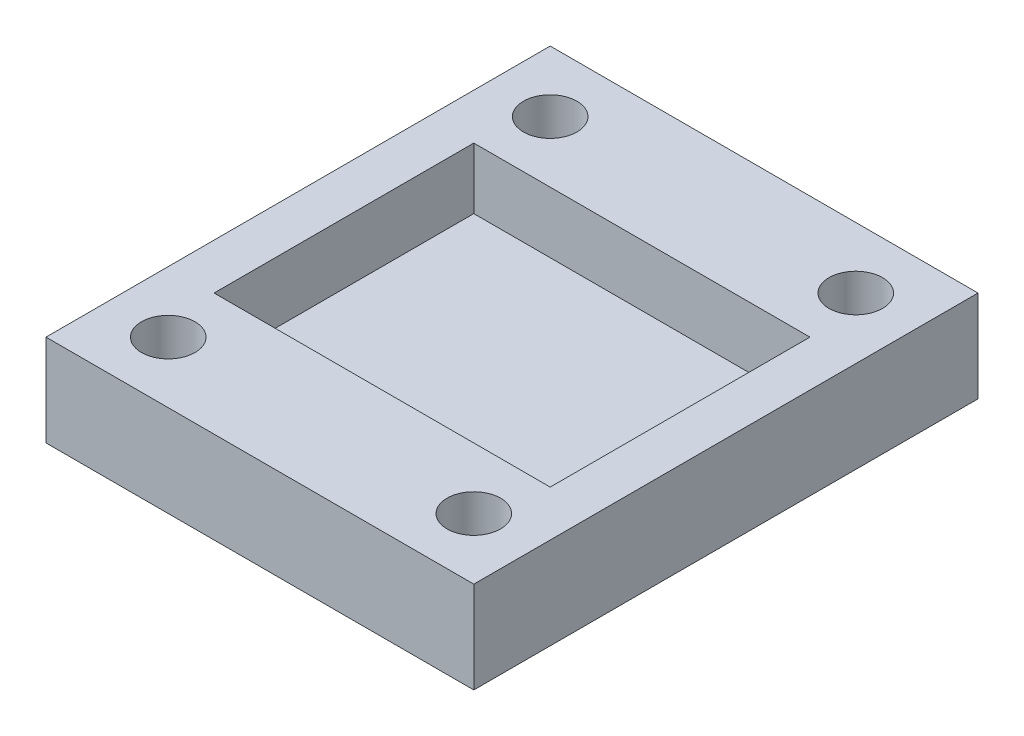
ISO-10303-21;
HEADER;
FILE_DESCRIPTION(('STEP AP214'),'2;1');
FILE_NAME('part.step','',(''),(''),'','','');
FILE_SCHEMA(('AUTOMOTIVE_DESIGN { 1 0 10303 214 1 1 1 1 }'));
ENDSEC;
DATA;
#1=APPLICATION_CONTEXT('core data for automotive mechanical design processes');
#2=APPLICATION_PROTOCOL_DEFINITION('international standard','automotive_design',2000,#1);
#3=PRODUCT_CONTEXT('',#1,'mechanical');
#4=PRODUCT('Part','Part','',(#3));
#5=PRODUCT_RELATED_PRODUCT_CATEGORY('part','',(#4));
#6=PRODUCT_DEFINITION_FORMATION('','',#4);
#7=PRODUCT_DEFINITION_CONTEXT('part definition',#1,'design');
#8=PRODUCT_DEFINITION('design','',#6,#7);
#9=PRODUCT_DEFINITION_SHAPE('','',#8);
#10=(LENGTH_UNIT() NAMED_UNIT(*) SI_UNIT(.MILLI.,.METRE.));
#11=(NAMED_UNIT(*) PLANE_ANGLE_UNIT() SI_UNIT($,.RADIAN.));
#12=(NAMED_UNIT(*) SI_UNIT($,.STERADIAN.) SOLID_ANGLE_UNIT());
#13=UNCERTAINTY_MEASURE_WITH_UNIT(LENGTH_MEASURE(1.E-05),#10,'distance_accuracy_value','');
#14=(GEOMETRIC_REPRESENTATION_CONTEXT(3) GLOBAL_UNCERTAINTY_ASSIGNED_CONTEXT((#13)) GLOBAL_UNIT_ASSIGNED_CONTEXT((#10,
#11,#12)) REPRESENTATION_CONTEXT('',''));
#15=CARTESIAN_POINT('',(0.,0.,0.));
#16=DIRECTION('',(0.,0.,1.));
#17=DIRECTION('',(1.,0.,0.));
#18=AXIS2_PLACEMENT_3D('',#15,#16,#17);
#19=CARTESIAN_POINT('',(0.,2.,0.));
#20=DIRECTION('',(0.,1.,0.));
#21=DIRECTION('',(0.,0.,1.));
#22=AXIS2_PLACEMENT_3D('',#19,#20,#21);
#23=PLANE('',#22);
#24=DIRECTION('',(1.,0.,0.));
#25=VECTOR('',#24,1.);
#26=CARTESIAN_POINT('',(0.,2.,0.));
#27=LINE('',#26,#25);
#28=CARTESIAN_POINT('',(0.,2.,0.));
#29=VERTEX_POINT('',#28);
#30=CARTESIAN_POINT('',(22.,2.,0.));
#31=VERTEX_POINT('',#30);
#32=EDGE_CURVE('E118',#29,#31,#27,.T.);
#33=ORIENTED_EDGE('',*,*,#32,.T.);
#34=DIRECTION('',(0.,0.,-1.));
#35=VECTOR('',#34,1.);
#36=CARTESIAN_POINT('',(22.,2.,0.));
#37=LINE('',#36,#35);
#38=CARTESIAN_POINT('',(22.,2.,-17.));
#39=VERTEX_POINT('',#38);
#40=EDGE_CURVE('E168',#31,#39,#37,.T.);
#41=ORIENTED_EDGE('',*,*,#40,.T.);
#42=DIRECTION('',(1.,0.,0.));
#43=VECTOR('',#42,1.);
#44=CARTESIAN_POINT('',(0.,2.,-17.));
#45=LINE('',#44,#43);
#46=CARTESIAN_POINT('',(0.,2.,-17.));
#47=VERTEX_POINT('',#46);
#48=EDGE_CURVE('E49',#47,#39,#45,.T.);
#49=ORIENTED_EDGE('',*,*,#48,.F.);
#50=DIRECTION('',(0.,0.,-1.));
#51=VECTOR('',#50,1.);
#52=CARTESIAN_POINT('',(0.,2.,0.));
#53=LINE('',#52,#51);
#54=EDGE_CURVE('E11',#29,#47,#53,.T.);
#55=ORIENTED_EDGE('',*,*,#54,.F.);
#56=EDGE_LOOP('',(#33,#41,#49,#55));
#57=FACE_BOUND('',#56,.T.);
#58=ADVANCED_FACE('F41',(#57),#23,.T.);
#59=CARTESIAN_POINT('',(0.,6.,0.));
#60=DIRECTION('',(0.,1.,0.));
#61=DIRECTION('',(0.,0.,1.));
#62=AXIS2_PLACEMENT_3D('',#59,#60,#61);
#63=PLANE('',#62);
#64=CARTESIAN_POINT('',(21.,6.,-21.));
#65=DIRECTION('',(0.,1.,0.));
#66=DIRECTION('',(0.,0.,1.));
#67=AXIS2_PLACEMENT_3D('',#64,#65,#66);
#68=CIRCLE('',#67,1.75);
#69=CARTESIAN_POINT('',(21.,6.,-19.25));
#70=VERTEX_POINT('',#69);
#71=EDGE_CURVE('E236',#70,#70,#68,.T.);
#72=ORIENTED_EDGE('',*,*,#71,.F.);
#73=EDGE_LOOP('',(#72));
#74=FACE_BOUND('',#73,.T.);
#75=CARTESIAN_POINT('',(0.999999999999985,6.,4.));
#76=DIRECTION('',(0.,1.,0.));
#77=DIRECTION('',(0.,0.,1.));
#78=AXIS2_PLACEMENT_3D('',#75,#76,#77);
#79=CIRCLE('',#78,1.75);
#80=CARTESIAN_POINT('',(0.999999999999985,6.,5.75));
#81=VERTEX_POINT('',#80);
#82=EDGE_CURVE('E112',#81,#81,#79,.T.);
#83=ORIENTED_EDGE('',*,*,#82,.F.);
#84=EDGE_LOOP('',(#83));
#85=FACE_BOUND('',#84,.T.);
#86=DIRECTION('',(1.,0.,0.));
#87=VECTOR('',#86,1.);
#88=CARTESIAN_POINT('',(-3.,6.,8.));
#89=LINE('',#88,#87);
#90=CARTESIAN_POINT('',(-3.,6.,8.));
#91=VERTEX_POINT('',#90);
#92=CARTESIAN_POINT('',(25.,6.,8.));
#93=VERTEX_POINT('',#92);
#94=EDGE_CURVE('E138',#91,#93,#89,.T.);
#95=ORIENTED_EDGE('',*,*,#94,.T.);
#96=DIRECTION('',(0.,0.,-1.));
#97=VECTOR('',#96,1.);
#98=CARTESIAN_POINT('',(25.,6.,8.));
#99=LINE('',#98,#97);
#100=CARTESIAN_POINT('',(25.,6.,-25.));
#101=VERTEX_POINT('',#100);
#102=EDGE_CURVE('E141',#93,#101,#99,.T.);
#103=ORIENTED_EDGE('',*,*,#102,.T.);
#104=DIRECTION('',(-1.,0.,0.));
#105=VECTOR('',#104,1.);
#106=CARTESIAN_POINT('',(25.,6.,-25.));
#107=LINE('',#106,#105);
#108=CARTESIAN_POINT('',(-3.,6.,-25.));
#109=VERTEX_POINT('',#108);
#110=EDGE_CURVE('E144',#101,#109,#107,.T.);
#111=ORIENTED_EDGE('',*,*,#110,.T.);
#112=DIRECTION('',(0.,0.,1.));
#113=VECTOR('',#112,1.);
#114=CARTESIAN_POINT('',(-3.,6.,8.));
#115=LINE('',#114,#113);
#116=EDGE_CURVE('E146',#109,#91,#115,.T.);
#117=ORIENTED_EDGE('',*,*,#116,.T.);
#118=EDGE_LOOP('',(#95,#103,#111,#117));
#119=FACE_BOUND('',#118,.T.);
#120=DIRECTION('',(1.,0.,0.));
#121=VECTOR('',#120,1.);
#122=CARTESIAN_POINT('',(0.,6.,0.));
#123=LINE('',#122,#121);
#124=CARTESIAN_POINT('',(0.,6.,0.));
#125=VERTEX_POINT('',#124);
#126=CARTESIAN_POINT('',(22.,6.,0.));
#127=VERTEX_POINT('',#126);
#128=EDGE_CURVE('E111',#125,#127,#123,.T.);
#129=ORIENTED_EDGE('',*,*,#128,.F.);
#130=DIRECTION('',(0.,0.,1.));
#131=VECTOR('',#130,1.);
#132=CARTESIAN_POINT('',(0.,6.,0.));
#133=LINE('',#132,#131);
#134=CARTESIAN_POINT('',(0.,6.,-17.));
#135=VERTEX_POINT('',#134);
#136=EDGE_CURVE('E102',#135,#125,#133,.T.);
#137=ORIENTED_EDGE('',*,*,#136,.F.);
#138=DIRECTION('',(-1.,0.,0.));
#139=VECTOR('',#138,1.);
#140=CARTESIAN_POINT('',(0.,6.,-17.));
#141=LINE('',#140,#139);
#142=CARTESIAN_POINT('',(22.,6.,-17.));
#143=VERTEX_POINT('',#142);
#144=EDGE_CURVE('E128',#143,#135,#141,.T.);
#145=ORIENTED_EDGE('',*,*,#144,.F.);
#146=DIRECTION('',(0.,0.,-1.));
#147=VECTOR('',#146,1.);
#148=CARTESIAN_POINT('',(22.,6.,0.));
#149=LINE('',#148,#147);
#150=EDGE_CURVE('E126',#127,#143,#149,.T.);
#151=ORIENTED_EDGE('',*,*,#150,.F.);
#152=EDGE_LOOP('',(#129,#137,#145,#151));
#153=FACE_BOUND('',#152,.T.);
#154=CARTESIAN_POINT('',(21.,6.,4.));
#155=DIRECTION('',(0.,1.,0.));
#156=DIRECTION('',(0.,0.,-1.));
#157=AXIS2_PLACEMENT_3D('',#154,#155,#156);
#158=CIRCLE('',#157,1.75);
#159=CARTESIAN_POINT('',(21.,6.,2.25));
#160=VERTEX_POINT('',#159);
#161=EDGE_CURVE('E242',#160,#160,#158,.T.);
#162=ORIENTED_EDGE('',*,*,#161,.F.);
#163=EDGE_LOOP('',(#162));
#164=FACE_BOUND('',#163,.T.);
#165=CARTESIAN_POINT('',(0.999999999999985,6.,-21.));
#166=DIRECTION('',(0.,1.,0.));
#167=DIRECTION('',(0.,0.,-1.));
#168=AXIS2_PLACEMENT_3D('',#165,#166,#167);
#169=CIRCLE('',#168,1.75);
#170=CARTESIAN_POINT('',(0.999999999999985,6.,-22.75));
#171=VERTEX_POINT('',#170);
#172=EDGE_CURVE('E227',#171,#171,#169,.T.);
#173=ORIENTED_EDGE('',*,*,#172,.F.);
#174=EDGE_LOOP('',(#173));
#175=FACE_BOUND('',#174,.T.);
#176=ADVANCED_FACE('F123',(#74,#85,#119,#153,#164,#175),#63,.T.);
#177=CARTESIAN_POINT('',(-3.,6.,8.));
#178=DIRECTION('',(0.,0.,-1.));
#179=DIRECTION('',(-1.,0.,0.));
#180=AXIS2_PLACEMENT_3D('',#177,#178,#179);
#181=PLANE('',#180);
#182=DIRECTION('',(1.,0.,0.));
#183=VECTOR('',#182,1.);
#184=CARTESIAN_POINT('',(-3.,0.,8.));
#185=LINE('',#184,#183);
#186=CARTESIAN_POINT('',(-3.,0.,8.));
#187=VERTEX_POINT('',#186);
#188=CARTESIAN_POINT('',(25.,0.,8.));
#189=VERTEX_POINT('',#188);
#190=EDGE_CURVE('E119',#187,#189,#185,.T.);
#191=ORIENTED_EDGE('',*,*,#190,.T.);
#192=DIRECTION('',(0.,-1.,0.));
#193=VECTOR('',#192,1.);
#194=CARTESIAN_POINT('',(25.,6.,8.));
#195=LINE('',#194,#193);
#196=EDGE_CURVE('E164',#93,#189,#195,.T.);
#197=ORIENTED_EDGE('',*,*,#196,.F.);
#198=ORIENTED_EDGE('',*,*,#94,.F.);
#199=DIRECTION('',(0.,-1.,0.));
#200=VECTOR('',#199,1.);
#201=CARTESIAN_POINT('',(-3.,6.,8.));
#202=LINE('',#201,#200);
#203=EDGE_CURVE('E148',#91,#187,#202,.T.);
#204=ORIENTED_EDGE('',*,*,#203,.T.);
#205=EDGE_LOOP('',(#191,#197,#198,#204));
#206=FACE_BOUND('',#205,.T.);
#207=ADVANCED_FACE('F178',(#206),#181,.F.);
#208=CARTESIAN_POINT('',(25.,6.,8.));
#209=DIRECTION('',(-1.,0.,0.));
#210=DIRECTION('',(0.,0.,1.));
#211=AXIS2_PLACEMENT_3D('',#208,#209,#210);
#212=PLANE('',#211);
#213=DIRECTION('',(0.,0.,-1.));
#214=VECTOR('',#213,1.);
#215=CARTESIAN_POINT('',(25.,0.,8.));
#216=LINE('',#215,#214);
#217=CARTESIAN_POINT('',(25.,0.,-25.));
#218=VERTEX_POINT('',#217);
#219=EDGE_CURVE('E151',#189,#218,#216,.T.);
#220=ORIENTED_EDGE('',*,*,#219,.T.);
#221=DIRECTION('',(0.,-1.,0.));
#222=VECTOR('',#221,1.);
#223=CARTESIAN_POINT('',(25.,6.,-25.));
#224=LINE('',#223,#222);
#225=EDGE_CURVE('E161',#101,#218,#224,.T.);
#226=ORIENTED_EDGE('',*,*,#225,.F.);
#227=ORIENTED_EDGE('',*,*,#102,.F.);
#228=ORIENTED_EDGE('',*,*,#196,.T.);
#229=EDGE_LOOP('',(#220,#226,#227,#228));
#230=FACE_BOUND('',#229,.T.);
#231=ADVANCED_FACE('F184',(#230),#212,.F.);
#232=CARTESIAN_POINT('',(25.,6.,-25.));
#233=DIRECTION('',(0.,0.,1.));
#234=DIRECTION('',(1.,0.,0.));
#235=AXIS2_PLACEMENT_3D('',#232,#233,#234);
#236=PLANE('',#235);
#237=DIRECTION('',(-1.,0.,0.));
#238=VECTOR('',#237,1.);
#239=CARTESIAN_POINT('',(25.,0.,-25.));
#240=LINE('',#239,#238);
#241=CARTESIAN_POINT('',(-3.,0.,-25.));
#242=VERTEX_POINT('',#241);
#243=EDGE_CURVE('E153',#218,#242,#240,.T.);
#244=ORIENTED_EDGE('',*,*,#243,.T.);
#245=DIRECTION('',(0.,-1.,0.));
#246=VECTOR('',#245,1.);
#247=CARTESIAN_POINT('',(-3.,6.,-25.));
#248=LINE('',#247,#246);
#249=EDGE_CURVE('E158',#109,#242,#248,.T.);
#250=ORIENTED_EDGE('',*,*,#249,.F.);
#251=ORIENTED_EDGE('',*,*,#110,.F.);
#252=ORIENTED_EDGE('',*,*,#225,.T.);
#253=EDGE_LOOP('',(#244,#250,#251,#252));
#254=FACE_BOUND('',#253,.T.);
#255=ADVANCED_FACE('F188',(#254),#236,.F.);
#256=CARTESIAN_POINT('',(-3.,6.,8.));
#257=DIRECTION('',(1.,0.,0.));
#258=DIRECTION('',(0.,0.,-1.));
#259=AXIS2_PLACEMENT_3D('',#256,#257,#258);
#260=PLANE('',#259);
#261=DIRECTION('',(0.,0.,1.));
#262=VECTOR('',#261,1.);
#263=CARTESIAN_POINT('',(-3.,0.,8.));
#264=LINE('',#263,#262);
#265=EDGE_CURVE('E142',#242,#187,#264,.T.);
#266=ORIENTED_EDGE('',*,*,#265,.T.);
#267=ORIENTED_EDGE('',*,*,#203,.F.);
#268=ORIENTED_EDGE('',*,*,#116,.F.);
#269=ORIENTED_EDGE('',*,*,#249,.T.);
#270=EDGE_LOOP('',(#266,#267,#268,#269));
#271=FACE_BOUND('',#270,.T.);
#272=ADVANCED_FACE('F192',(#271),#260,.F.);
#273=CARTESIAN_POINT('',(0.,6.,0.));
#274=DIRECTION('',(1.,0.,0.));
#275=DIRECTION('',(0.,0.,-1.));
#276=AXIS2_PLACEMENT_3D('',#273,#274,#275);
#277=PLANE('',#276);
#278=DIRECTION('',(0.,-1.,0.));
#279=VECTOR('',#278,1.);
#280=CARTESIAN_POINT('',(0.,6.,0.));
#281=LINE('',#280,#279);
#282=EDGE_CURVE('E105',#125,#29,#281,.T.);
#283=ORIENTED_EDGE('',*,*,#282,.T.);
#284=ORIENTED_EDGE('',*,*,#54,.T.);
#285=DIRECTION('',(0.,-1.,0.));
#286=VECTOR('',#285,1.);
#287=CARTESIAN_POINT('',(0.,6.,-17.));
#288=LINE('',#287,#286);
#289=EDGE_CURVE('E107',#135,#47,#288,.T.);
#290=ORIENTED_EDGE('',*,*,#289,.F.);
#291=ORIENTED_EDGE('',*,*,#136,.T.);
#292=EDGE_LOOP('',(#283,#284,#290,#291));
#293=FACE_BOUND('',#292,.T.);
#294=ADVANCED_FACE('F104',(#293),#277,.T.);
#295=CARTESIAN_POINT('',(0.,6.,0.));
#296=DIRECTION('',(0.,0.,-1.));
#297=DIRECTION('',(-1.,0.,0.));
#298=AXIS2_PLACEMENT_3D('',#295,#296,#297);
#299=PLANE('',#298);
#300=DIRECTION('',(0.,-1.,0.));
#301=VECTOR('',#300,1.);
#302=CARTESIAN_POINT('',(22.,6.,0.));
#303=LINE('',#302,#301);
#304=EDGE_CURVE('E120',#127,#31,#303,.T.);
#305=ORIENTED_EDGE('',*,*,#304,.T.);
#306=ORIENTED_EDGE('',*,*,#32,.F.);
#307=ORIENTED_EDGE('',*,*,#282,.F.);
#308=ORIENTED_EDGE('',*,*,#128,.T.);
#309=EDGE_LOOP('',(#305,#306,#307,#308));
#310=FACE_BOUND('',#309,.T.);
#311=ADVANCED_FACE('F116',(#310),#299,.T.);
#312=CARTESIAN_POINT('',(22.,6.,0.));
#313=DIRECTION('',(-1.,0.,0.));
#314=DIRECTION('',(0.,0.,1.));
#315=AXIS2_PLACEMENT_3D('',#312,#313,#314);
#316=PLANE('',#315);
#317=DIRECTION('',(0.,-1.,0.));
#318=VECTOR('',#317,1.);
#319=CARTESIAN_POINT('',(22.,6.,-17.));
#320=LINE('',#319,#318);
#321=EDGE_CURVE('E134',#143,#39,#320,.T.);
#322=ORIENTED_EDGE('',*,*,#321,.T.);
#323=ORIENTED_EDGE('',*,*,#40,.F.);
#324=ORIENTED_EDGE('',*,*,#304,.F.);
#325=ORIENTED_EDGE('',*,*,#150,.T.);
#326=EDGE_LOOP('',(#322,#323,#324,#325));
#327=FACE_BOUND('',#326,.T.);
#328=ADVANCED_FACE('F173',(#327),#316,.T.);
#329=CARTESIAN_POINT('',(0.,6.,-17.));
#330=DIRECTION('',(0.,0.,1.));
#331=DIRECTION('',(1.,0.,0.));
#332=AXIS2_PLACEMENT_3D('',#329,#330,#331);
#333=PLANE('',#332);
#334=ORIENTED_EDGE('',*,*,#289,.T.);
#335=ORIENTED_EDGE('',*,*,#48,.T.);
#336=ORIENTED_EDGE('',*,*,#321,.F.);
#337=ORIENTED_EDGE('',*,*,#144,.T.);
#338=EDGE_LOOP('',(#334,#335,#336,#337));
#339=FACE_BOUND('',#338,.T.);
#340=ADVANCED_FACE('F170',(#339),#333,.T.);
#341=CARTESIAN_POINT('',(0.999999999999985,6.,4.));
#342=DIRECTION('',(0.,-1.,0.));
#343=DIRECTION('',(0.,0.,-1.));
#344=AXIS2_PLACEMENT_3D('',#341,#342,#343);
#345=CYLINDRICAL_SURFACE('',#344,1.75);
#346=ORIENTED_EDGE('',*,*,#82,.T.);
#347=EDGE_LOOP('',(#346));
#348=FACE_BOUND('',#347,.T.);
#349=CARTESIAN_POINT('',(0.999999999999985,0.,4.));
#350=DIRECTION('',(0.,1.,0.));
#351=DIRECTION('',(0.,0.,1.));
#352=AXIS2_PLACEMENT_3D('',#349,#350,#351);
#353=CIRCLE('',#352,1.75);
#354=CARTESIAN_POINT('',(0.999999999999985,0.,5.75));
#355=VERTEX_POINT('',#354);
#356=EDGE_CURVE('E245',#355,#355,#353,.T.);
#357=ORIENTED_EDGE('',*,*,#356,.F.);
#358=EDGE_LOOP('',(#357));
#359=FACE_BOUND('',#358,.T.);
#360=ADVANCED_FACE('F205',(#348,#359),#345,.F.);
#361=CARTESIAN_POINT('',(21.,6.,4.));
#362=DIRECTION('',(0.,-1.,0.));
#363=DIRECTION('',(0.,0.,-1.));
#364=AXIS2_PLACEMENT_3D('',#361,#362,#363);
#365=CYLINDRICAL_SURFACE('',#364,1.75);
#366=ORIENTED_EDGE('',*,*,#161,.T.);
#367=EDGE_LOOP('',(#366));
#368=FACE_BOUND('',#367,.T.);
#369=CARTESIAN_POINT('',(21.,0.,4.));
#370=DIRECTION('',(0.,1.,0.));
#371=DIRECTION('',(0.,0.,-1.));
#372=AXIS2_PLACEMENT_3D('',#369,#370,#371);
#373=CIRCLE('',#372,1.75);
#374=CARTESIAN_POINT('',(21.,0.,2.25));
#375=VERTEX_POINT('',#374);
#376=EDGE_CURVE('E239',#375,#375,#373,.T.);
#377=ORIENTED_EDGE('',*,*,#376,.F.);
#378=EDGE_LOOP('',(#377));
#379=FACE_BOUND('',#378,.T.);
#380=ADVANCED_FACE('F208',(#368,#379),#365,.F.);
#381=CARTESIAN_POINT('',(21.,6.,-21.));
#382=DIRECTION('',(0.,-1.,0.));
#383=DIRECTION('',(0.,0.,-1.));
#384=AXIS2_PLACEMENT_3D('',#381,#382,#383);
#385=CYLINDRICAL_SURFACE('',#384,1.75);
#386=ORIENTED_EDGE('',*,*,#71,.T.);
#387=EDGE_LOOP('',(#386));
#388=FACE_BOUND('',#387,.T.);
#389=CARTESIAN_POINT('',(21.,0.,-21.));
#390=DIRECTION('',(0.,1.,0.));
#391=DIRECTION('',(0.,0.,1.));
#392=AXIS2_PLACEMENT_3D('',#389,#390,#391);
#393=CIRCLE('',#392,1.75);
#394=CARTESIAN_POINT('',(21.,0.,-19.25));
#395=VERTEX_POINT('',#394);
#396=EDGE_CURVE('E233',#395,#395,#393,.T.);
#397=ORIENTED_EDGE('',*,*,#396,.F.);
#398=EDGE_LOOP('',(#397));
#399=FACE_BOUND('',#398,.T.);
#400=ADVANCED_FACE('F212',(#388,#399),#385,.F.);
#401=CARTESIAN_POINT('',(0.999999999999985,6.,-21.));
#402=DIRECTION('',(0.,-1.,0.));
#403=DIRECTION('',(0.,0.,-1.));
#404=AXIS2_PLACEMENT_3D('',#401,#402,#403);
#405=CYLINDRICAL_SURFACE('',#404,1.75);
#406=ORIENTED_EDGE('',*,*,#172,.T.);
#407=EDGE_LOOP('',(#406));
#408=FACE_BOUND('',#407,.T.);
#409=CARTESIAN_POINT('',(0.999999999999985,0.,-21.));
#410=DIRECTION('',(0.,1.,0.));
#411=DIRECTION('',(0.,0.,-1.));
#412=AXIS2_PLACEMENT_3D('',#409,#410,#411);
#413=CIRCLE('',#412,1.75);
#414=CARTESIAN_POINT('',(0.999999999999985,0.,-22.75));
#415=VERTEX_POINT('',#414);
#416=EDGE_CURVE('E230',#415,#415,#413,.T.);
#417=ORIENTED_EDGE('',*,*,#416,.F.);
#418=EDGE_LOOP('',(#417));
#419=FACE_BOUND('',#418,.T.);
#420=ADVANCED_FACE('F216',(#408,#419),#405,.F.);
#421=CARTESIAN_POINT('',(0.,0.,0.));
#422=DIRECTION('',(0.,1.,0.));
#423=DIRECTION('',(0.,0.,1.));
#424=AXIS2_PLACEMENT_3D('',#421,#422,#423);
#425=PLANE('',#424);
#426=ORIENTED_EDGE('',*,*,#190,.F.);
#427=ORIENTED_EDGE('',*,*,#265,.F.);
#428=ORIENTED_EDGE('',*,*,#243,.F.);
#429=ORIENTED_EDGE('',*,*,#219,.F.);
#430=EDGE_LOOP('',(#426,#427,#428,#429));
#431=FACE_BOUND('',#430,.T.);
#432=ORIENTED_EDGE('',*,*,#356,.T.);
#433=EDGE_LOOP('',(#432));
#434=FACE_BOUND('',#433,.T.);
#435=ORIENTED_EDGE('',*,*,#376,.T.);
#436=EDGE_LOOP('',(#435));
#437=FACE_BOUND('',#436,.T.);
#438=ORIENTED_EDGE('',*,*,#396,.T.);
#439=EDGE_LOOP('',(#438));
#440=FACE_BOUND('',#439,.T.);
#441=ORIENTED_EDGE('',*,*,#416,.T.);
#442=EDGE_LOOP('',(#441));
#443=FACE_BOUND('',#442,.T.);
#444=ADVANCED_FACE('F43',(#431,#434,#437,#440,#443),#425,.F.);
#445=CLOSED_SHELL('',(#58,#176,#207,#231,#255,#272,#294,#311,#328,#340,#360,#380,#400,#420,#444));
#446=MANIFOLD_SOLID_BREP('B2',#445);
#447=ADVANCED_BREP_SHAPE_REPRESENTATION('',(#18,#446),#14);
#448=SHAPE_DEFINITION_REPRESENTATION(#9,#447);
ENDSEC;
END-ISO-10303-21;
